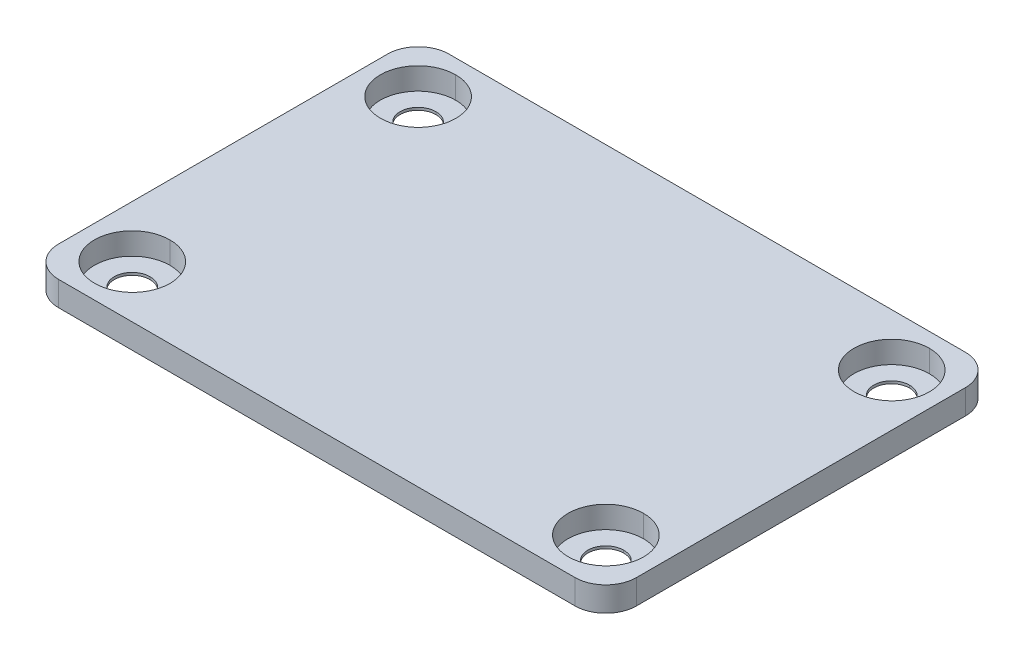
ISO-10303-21;
HEADER;
FILE_DESCRIPTION(('STEP AP214'),'2;1');
FILE_NAME('part.step','',(''),(''),'','','');
FILE_SCHEMA(('AUTOMOTIVE_DESIGN { 1 0 10303 214 1 1 1 1 }'));
ENDSEC;
DATA;
#1=APPLICATION_CONTEXT('core data for automotive mechanical design processes');
#2=APPLICATION_PROTOCOL_DEFINITION('international standard','automotive_design',2000,#1);
#3=PRODUCT_CONTEXT('',#1,'mechanical');
#4=PRODUCT('Part','Part','',(#3));
#5=PRODUCT_RELATED_PRODUCT_CATEGORY('part','',(#4));
#6=PRODUCT_DEFINITION_FORMATION('','',#4);
#7=PRODUCT_DEFINITION_CONTEXT('part definition',#1,'design');
#8=PRODUCT_DEFINITION('design','',#6,#7);
#9=PRODUCT_DEFINITION_SHAPE('','',#8);
#10=(LENGTH_UNIT() NAMED_UNIT(*) SI_UNIT(.MILLI.,.METRE.));
#11=(NAMED_UNIT(*) PLANE_ANGLE_UNIT() SI_UNIT($,.RADIAN.));
#12=(NAMED_UNIT(*) SI_UNIT($,.STERADIAN.) SOLID_ANGLE_UNIT());
#13=UNCERTAINTY_MEASURE_WITH_UNIT(LENGTH_MEASURE(1.E-05),#10,'distance_accuracy_value','');
#14=(GEOMETRIC_REPRESENTATION_CONTEXT(3) GLOBAL_UNCERTAINTY_ASSIGNED_CONTEXT((#13)) GLOBAL_UNIT_ASSIGNED_CONTEXT((#10,
#11,#12)) REPRESENTATION_CONTEXT('',''));
#15=CARTESIAN_POINT('',(0.,0.,0.));
#16=DIRECTION('',(0.,0.,1.));
#17=DIRECTION('',(1.,0.,0.));
#18=AXIS2_PLACEMENT_3D('',#15,#16,#17);
#19=CARTESIAN_POINT('',(-23.4468138885607,0.42,-47.7828830453356));
#20=DIRECTION('',(0.,-1.,0.));
#21=DIRECTION('',(0.,0.,-1.));
#22=AXIS2_PLACEMENT_3D('',#19,#20,#21);
#23=PLANE('',#22);
#24=CARTESIAN_POINT('',(-26.3468138885607,0.42,-47.7828830453356));
#25=DIRECTION('',(0.,1.,0.));
#26=DIRECTION('',(0.,0.,1.));
#27=AXIS2_PLACEMENT_3D('',#24,#25,#26);
#28=CIRCLE('',#27,6.12);
#29=CARTESIAN_POINT('',(-26.3218138885556,0.42,-53.902831983031));
#30=VERTEX_POINT('',#29);
#31=CARTESIAN_POINT('',(-26.3218138885658,0.42,-41.6629341076401));
#32=VERTEX_POINT('',#31);
#33=EDGE_CURVE('E226',#30,#32,#28,.T.);
#34=ORIENTED_EDGE('',*,*,#33,.T.);
#35=CARTESIAN_POINT('',(-26.2968138885607,0.42,-47.7828830453355));
#36=DIRECTION('',(0.,1.,0.));
#37=DIRECTION('',(0.,0.,1.));
#38=AXIS2_PLACEMENT_3D('',#35,#36,#37);
#39=CIRCLE('',#38,6.12);
#40=EDGE_CURVE('E686',#32,#30,#39,.T.);
#41=ORIENTED_EDGE('',*,*,#40,.T.);
#42=EDGE_LOOP('',(#34,#41));
#43=FACE_BOUND('',#42,.T.);
#44=CARTESIAN_POINT('',(-26.2968138885607,0.42,-47.7828830453355));
#45=DIRECTION('',(0.,1.,0.));
#46=DIRECTION('',(0.,0.,1.));
#47=AXIS2_PLACEMENT_3D('',#44,#45,#46);
#48=CIRCLE('',#47,2.9);
#49=CARTESIAN_POINT('',(-26.3218138885631,0.42,-44.8829908059584));
#50=VERTEX_POINT('',#49);
#51=CARTESIAN_POINT('',(-26.3218138885583,0.42,-50.6827752847127));
#52=VERTEX_POINT('',#51);
#53=EDGE_CURVE('E201',#50,#52,#48,.T.);
#54=ORIENTED_EDGE('',*,*,#53,.F.);
#55=CARTESIAN_POINT('',(-26.3468138885607,0.42,-47.7828830453356));
#56=DIRECTION('',(0.,1.,0.));
#57=DIRECTION('',(0.,0.,1.));
#58=AXIS2_PLACEMENT_3D('',#55,#56,#57);
#59=CIRCLE('',#58,2.9);
#60=EDGE_CURVE('E218',#52,#50,#59,.T.);
#61=ORIENTED_EDGE('',*,*,#60,.F.);
#62=EDGE_LOOP('',(#54,#61));
#63=FACE_BOUND('',#62,.T.);
#64=ADVANCED_FACE('F39',(#43,#63),#23,.F.);
#65=CARTESIAN_POINT('',(-23.4468138885607,0.42,-1.28288304533556));
#66=DIRECTION('',(0.,-1.,0.));
#67=DIRECTION('',(0.,0.,-1.));
#68=AXIS2_PLACEMENT_3D('',#65,#66,#67);
#69=PLANE('',#68);
#70=CARTESIAN_POINT('',(-26.3468138885607,0.42,-1.28288304533556));
#71=DIRECTION('',(0.,1.,0.));
#72=DIRECTION('',(0.,0.,1.));
#73=AXIS2_PLACEMENT_3D('',#70,#71,#72);
#74=CIRCLE('',#73,6.12);
#75=CARTESIAN_POINT('',(-26.3218138885596,0.42,-7.40283198303102));
#76=VERTEX_POINT('',#75);
#77=CARTESIAN_POINT('',(-26.3218138885619,0.42,4.83706589235992));
#78=VERTEX_POINT('',#77);
#79=EDGE_CURVE('E240',#76,#78,#74,.T.);
#80=ORIENTED_EDGE('',*,*,#79,.T.);
#81=CARTESIAN_POINT('',(-26.2968138885607,0.42,-1.28288304533555));
#82=DIRECTION('',(0.,1.,0.));
#83=DIRECTION('',(0.,0.,1.));
#84=AXIS2_PLACEMENT_3D('',#81,#82,#83);
#85=CIRCLE('',#84,6.12);
#86=EDGE_CURVE('E702',#78,#76,#85,.T.);
#87=ORIENTED_EDGE('',*,*,#86,.T.);
#88=EDGE_LOOP('',(#80,#87));
#89=FACE_BOUND('',#88,.T.);
#90=CARTESIAN_POINT('',(-26.2968138885607,0.42,-1.28288304533555));
#91=DIRECTION('',(0.,1.,0.));
#92=DIRECTION('',(0.,0.,1.));
#93=AXIS2_PLACEMENT_3D('',#90,#91,#92);
#94=CIRCLE('',#93,2.9);
#95=CARTESIAN_POINT('',(-26.3218138885613,0.42,1.61700919404163));
#96=VERTEX_POINT('',#95);
#97=CARTESIAN_POINT('',(-26.3218138885602,0.42,-4.18277528471273));
#98=VERTEX_POINT('',#97);
#99=EDGE_CURVE('E213',#96,#98,#94,.T.);
#100=ORIENTED_EDGE('',*,*,#99,.F.);
#101=CARTESIAN_POINT('',(-26.3468138885607,0.42,-1.28288304533556));
#102=DIRECTION('',(0.,1.,0.));
#103=DIRECTION('',(0.,0.,1.));
#104=AXIS2_PLACEMENT_3D('',#101,#102,#103);
#105=CIRCLE('',#104,2.9);
#106=EDGE_CURVE('E244',#98,#96,#105,.T.);
#107=ORIENTED_EDGE('',*,*,#106,.F.);
#108=EDGE_LOOP('',(#100,#107));
#109=FACE_BOUND('',#108,.T.);
#110=ADVANCED_FACE('F396',(#89,#109),#69,.F.);
#111=CARTESIAN_POINT('',(53.6031861114393,0.42,-47.7828830453356));
#112=DIRECTION('',(0.,-1.,0.));
#113=DIRECTION('',(0.,0.,-1.));
#114=AXIS2_PLACEMENT_3D('',#111,#112,#113);
#115=PLANE('',#114);
#116=CARTESIAN_POINT('',(50.7031861114393,0.42,-47.7828830453356));
#117=DIRECTION('',(0.,1.,0.));
#118=DIRECTION('',(0.,0.,1.));
#119=AXIS2_PLACEMENT_3D('',#116,#117,#118);
#120=CIRCLE('',#119,6.12);
#121=CARTESIAN_POINT('',(50.7281861114427,0.42,-53.902831983031));
#122=VERTEX_POINT('',#121);
#123=CARTESIAN_POINT('',(50.7281861114359,0.42,-41.6629341076401));
#124=VERTEX_POINT('',#123);
#125=EDGE_CURVE('E266',#122,#124,#120,.T.);
#126=ORIENTED_EDGE('',*,*,#125,.T.);
#127=CARTESIAN_POINT('',(50.7531861114393,0.42,-47.7828830453355));
#128=DIRECTION('',(0.,1.,0.));
#129=DIRECTION('',(0.,0.,1.));
#130=AXIS2_PLACEMENT_3D('',#127,#128,#129);
#131=CIRCLE('',#130,6.12);
#132=EDGE_CURVE('E731',#124,#122,#131,.T.);
#133=ORIENTED_EDGE('',*,*,#132,.T.);
#134=EDGE_LOOP('',(#126,#133));
#135=FACE_BOUND('',#134,.T.);
#136=CARTESIAN_POINT('',(50.7531861114393,0.42,-47.7828830453355));
#137=DIRECTION('',(0.,1.,0.));
#138=DIRECTION('',(0.,0.,1.));
#139=AXIS2_PLACEMENT_3D('',#136,#137,#138);
#140=CIRCLE('',#139,2.9);
#141=CARTESIAN_POINT('',(50.7281861114377,0.42,-44.8829908059584));
#142=VERTEX_POINT('',#141);
#143=CARTESIAN_POINT('',(50.7281861114409,0.42,-50.6827752847127));
#144=VERTEX_POINT('',#143);
#145=EDGE_CURVE('E708',#142,#144,#140,.T.);
#146=ORIENTED_EDGE('',*,*,#145,.F.);
#147=CARTESIAN_POINT('',(50.7031861114393,0.42,-47.7828830453356));
#148=DIRECTION('',(0.,1.,0.));
#149=DIRECTION('',(0.,0.,1.));
#150=AXIS2_PLACEMENT_3D('',#147,#148,#149);
#151=CIRCLE('',#150,2.9);
#152=EDGE_CURVE('E270',#144,#142,#151,.T.);
#153=ORIENTED_EDGE('',*,*,#152,.F.);
#154=EDGE_LOOP('',(#146,#153));
#155=FACE_BOUND('',#154,.T.);
#156=ADVANCED_FACE('F402',(#135,#155),#115,.F.);
#157=CARTESIAN_POINT('',(53.6031861114393,0.42,-1.28288304533555));
#158=DIRECTION('',(0.,-1.,0.));
#159=DIRECTION('',(0.,0.,-1.));
#160=AXIS2_PLACEMENT_3D('',#157,#158,#159);
#161=PLANE('',#160);
#162=CARTESIAN_POINT('',(50.7031861114393,0.42,-1.28288304533555));
#163=DIRECTION('',(0.,1.,0.));
#164=DIRECTION('',(0.,0.,1.));
#165=AXIS2_PLACEMENT_3D('',#162,#163,#164);
#166=CIRCLE('',#165,6.12);
#167=CARTESIAN_POINT('',(50.7281861114401,0.42,-7.40283198303103));
#168=VERTEX_POINT('',#167);
#169=CARTESIAN_POINT('',(50.7281861114384,0.42,4.83706589235993));
#170=VERTEX_POINT('',#169);
#171=EDGE_CURVE('E253',#168,#170,#166,.T.);
#172=ORIENTED_EDGE('',*,*,#171,.T.);
#173=CARTESIAN_POINT('',(50.7531861114393,0.42,-1.28288304533555));
#174=DIRECTION('',(0.,1.,0.));
#175=DIRECTION('',(0.,0.,1.));
#176=AXIS2_PLACEMENT_3D('',#173,#174,#175);
#177=CIRCLE('',#176,6.12);
#178=EDGE_CURVE('E759',#170,#168,#177,.T.);
#179=ORIENTED_EDGE('',*,*,#178,.T.);
#180=EDGE_LOOP('',(#172,#179));
#181=FACE_BOUND('',#180,.T.);
#182=CARTESIAN_POINT('',(50.7531861114393,0.42,-1.28288304533555));
#183=DIRECTION('',(0.,1.,0.));
#184=DIRECTION('',(0.,0.,1.));
#185=AXIS2_PLACEMENT_3D('',#182,#183,#184);
#186=CIRCLE('',#185,2.9);
#187=CARTESIAN_POINT('',(50.7281861114389,0.42,1.61700919404163));
#188=VERTEX_POINT('',#187);
#189=CARTESIAN_POINT('',(50.7281861114397,0.42,-4.18277528471273));
#190=VERTEX_POINT('',#189);
#191=EDGE_CURVE('E290',#188,#190,#186,.T.);
#192=ORIENTED_EDGE('',*,*,#191,.F.);
#193=CARTESIAN_POINT('',(50.7031861114393,0.42,-1.28288304533555));
#194=DIRECTION('',(0.,1.,0.));
#195=DIRECTION('',(0.,0.,1.));
#196=AXIS2_PLACEMENT_3D('',#193,#194,#195);
#197=CIRCLE('',#196,2.9);
#198=EDGE_CURVE('E257',#190,#188,#197,.T.);
#199=ORIENTED_EDGE('',*,*,#198,.F.);
#200=EDGE_LOOP('',(#192,#199));
#201=FACE_BOUND('',#200,.T.);
#202=ADVANCED_FACE('F424',(#181,#201),#161,.F.);
#203=CARTESIAN_POINT('',(-34.7968138885607,4.,-56.2828830453355));
#204=DIRECTION('',(1.,0.,0.));
#205=DIRECTION('',(0.,0.,-1.));
#206=AXIS2_PLACEMENT_3D('',#203,#204,#205);
#207=PLANE('',#206);
#208=DIRECTION('',(0.,0.,1.));
#209=VECTOR('',#208,1.);
#210=CARTESIAN_POINT('',(-34.7968138885607,0.,-56.2828830453355));
#211=LINE('',#210,#209);
#212=CARTESIAN_POINT('',(-34.7968138885607,0.,-51.2828830453356));
#213=VERTEX_POINT('',#212);
#214=CARTESIAN_POINT('',(-34.7968138885607,0.,2.21711695466446));
#215=VERTEX_POINT('',#214);
#216=EDGE_CURVE('E291',#213,#215,#211,.T.);
#217=ORIENTED_EDGE('',*,*,#216,.T.);
#218=DIRECTION('',(0.,-1.,0.));
#219=VECTOR('',#218,1.);
#220=CARTESIAN_POINT('',(-34.7968138885607,4.,2.21711695466446));
#221=LINE('',#220,#219);
#222=CARTESIAN_POINT('',(-34.7968138885607,4.,2.21711695466446));
#223=VERTEX_POINT('',#222);
#224=EDGE_CURVE('E11',#215,#223,#221,.F.);
#225=ORIENTED_EDGE('',*,*,#224,.T.);
#226=DIRECTION('',(0.,0.,1.));
#227=VECTOR('',#226,1.);
#228=CARTESIAN_POINT('',(-34.7968138885607,4.,-56.2828830453355));
#229=LINE('',#228,#227);
#230=CARTESIAN_POINT('',(-34.7968138885607,4.,-51.2828830453356));
#231=VERTEX_POINT('',#230);
#232=EDGE_CURVE('E275',#231,#223,#229,.T.);
#233=ORIENTED_EDGE('',*,*,#232,.F.);
#234=DIRECTION('',(0.,-1.,0.));
#235=VECTOR('',#234,1.);
#236=CARTESIAN_POINT('',(-34.7968138885607,4.,-51.2828830453356));
#237=LINE('',#236,#235);
#238=EDGE_CURVE('E48',#231,#213,#237,.T.);
#239=ORIENTED_EDGE('',*,*,#238,.T.);
#240=EDGE_LOOP('',(#217,#225,#233,#239));
#241=FACE_BOUND('',#240,.T.);
#242=ADVANCED_FACE('F361',(#241),#207,.F.);
#243=CARTESIAN_POINT('',(-34.7968138885607,4.,7.21711695466445));
#244=DIRECTION('',(0.,0.,-1.));
#245=DIRECTION('',(-1.,0.,0.));
#246=AXIS2_PLACEMENT_3D('',#243,#244,#245);
#247=PLANE('',#246);
#248=DIRECTION('',(1.,0.,0.));
#249=VECTOR('',#248,1.);
#250=CARTESIAN_POINT('',(-34.7968138885607,0.,7.21711695466445));
#251=LINE('',#250,#249);
#252=CARTESIAN_POINT('',(-29.7968138885607,0.,7.21711695466445));
#253=VERTEX_POINT('',#252);
#254=CARTESIAN_POINT('',(54.2031861114393,0.,7.21711695466445));
#255=VERTEX_POINT('',#254);
#256=EDGE_CURVE('E295',#253,#255,#251,.T.);
#257=ORIENTED_EDGE('',*,*,#256,.T.);
#258=DIRECTION('',(0.,-1.,0.));
#259=VECTOR('',#258,1.);
#260=CARTESIAN_POINT('',(54.2031861114393,4.,7.21711695466445));
#261=LINE('',#260,#259);
#262=CARTESIAN_POINT('',(54.2031861114393,4.,7.21711695466445));
#263=VERTEX_POINT('',#262);
#264=EDGE_CURVE('E336',#255,#263,#261,.F.);
#265=ORIENTED_EDGE('',*,*,#264,.T.);
#266=DIRECTION('',(1.,0.,0.));
#267=VECTOR('',#266,1.);
#268=CARTESIAN_POINT('',(-34.7968138885607,4.,7.21711695466445));
#269=LINE('',#268,#267);
#270=CARTESIAN_POINT('',(-29.7968138885607,4.,7.21711695466445));
#271=VERTEX_POINT('',#270);
#272=EDGE_CURVE('E279',#271,#263,#269,.T.);
#273=ORIENTED_EDGE('',*,*,#272,.F.);
#274=DIRECTION('',(0.,-1.,0.));
#275=VECTOR('',#274,1.);
#276=CARTESIAN_POINT('',(-29.7968138885607,4.,7.21711695466445));
#277=LINE('',#276,#275);
#278=EDGE_CURVE('E332',#271,#253,#277,.T.);
#279=ORIENTED_EDGE('',*,*,#278,.T.);
#280=EDGE_LOOP('',(#257,#265,#273,#279));
#281=FACE_BOUND('',#280,.T.);
#282=ADVANCED_FACE('F376',(#281),#247,.F.);
#283=CARTESIAN_POINT('',(59.2031861114393,4.,-56.2828830453355));
#284=DIRECTION('',(-1.,0.,0.));
#285=DIRECTION('',(0.,0.,1.));
#286=AXIS2_PLACEMENT_3D('',#283,#284,#285);
#287=PLANE('',#286);
#288=DIRECTION('',(0.,0.,-1.));
#289=VECTOR('',#288,1.);
#290=CARTESIAN_POINT('',(59.2031861114393,4.,-56.2828830453355));
#291=LINE('',#290,#289);
#292=CARTESIAN_POINT('',(59.2031861114393,4.,2.21711695466446));
#293=VERTEX_POINT('',#292);
#294=CARTESIAN_POINT('',(59.2031861114393,4.,-51.2828830453356));
#295=VERTEX_POINT('',#294);
#296=EDGE_CURVE('E284',#293,#295,#291,.T.);
#297=ORIENTED_EDGE('',*,*,#296,.F.);
#298=DIRECTION('',(0.,-1.,0.));
#299=VECTOR('',#298,1.);
#300=CARTESIAN_POINT('',(59.2031861114393,4.,2.21711695466446));
#301=LINE('',#300,#299);
#302=CARTESIAN_POINT('',(59.2031861114393,0.,2.21711695466446));
#303=VERTEX_POINT('',#302);
#304=EDGE_CURVE('E316',#293,#303,#301,.T.);
#305=ORIENTED_EDGE('',*,*,#304,.T.);
#306=DIRECTION('',(0.,0.,-1.));
#307=VECTOR('',#306,1.);
#308=CARTESIAN_POINT('',(59.2031861114393,0.,-56.2828830453355));
#309=LINE('',#308,#307);
#310=CARTESIAN_POINT('',(59.2031861114393,0.,-51.2828830453356));
#311=VERTEX_POINT('',#310);
#312=EDGE_CURVE('E299',#303,#311,#309,.T.);
#313=ORIENTED_EDGE('',*,*,#312,.T.);
#314=DIRECTION('',(0.,-1.,0.));
#315=VECTOR('',#314,1.);
#316=CARTESIAN_POINT('',(59.2031861114393,4.,-51.2828830453356));
#317=LINE('',#316,#315);
#318=EDGE_CURVE('E212',#311,#295,#317,.F.);
#319=ORIENTED_EDGE('',*,*,#318,.T.);
#320=EDGE_LOOP('',(#297,#305,#313,#319));
#321=FACE_BOUND('',#320,.T.);
#322=ADVANCED_FACE('F385',(#321),#287,.F.);
#323=CARTESIAN_POINT('',(-34.7968138885607,4.,-56.2828830453355));
#324=DIRECTION('',(0.,0.,1.));
#325=DIRECTION('',(1.,0.,0.));
#326=AXIS2_PLACEMENT_3D('',#323,#324,#325);
#327=PLANE('',#326);
#328=DIRECTION('',(-1.,0.,0.));
#329=VECTOR('',#328,1.);
#330=CARTESIAN_POINT('',(-34.7968138885607,4.,-56.2828830453355));
#331=LINE('',#330,#329);
#332=CARTESIAN_POINT('',(54.2031861114393,4.,-56.2828830453355));
#333=VERTEX_POINT('',#332);
#334=CARTESIAN_POINT('',(-29.7968138885607,4.,-56.2828830453355));
#335=VERTEX_POINT('',#334);
#336=EDGE_CURVE('E287',#333,#335,#331,.T.);
#337=ORIENTED_EDGE('',*,*,#336,.F.);
#338=DIRECTION('',(0.,-1.,0.));
#339=VECTOR('',#338,1.);
#340=CARTESIAN_POINT('',(54.2031861114393,4.,-56.2828830453355));
#341=LINE('',#340,#339);
#342=CARTESIAN_POINT('',(54.2031861114393,0.,-56.2828830453355));
#343=VERTEX_POINT('',#342);
#344=EDGE_CURVE('E352',#333,#343,#341,.T.);
#345=ORIENTED_EDGE('',*,*,#344,.T.);
#346=DIRECTION('',(-1.,0.,0.));
#347=VECTOR('',#346,1.);
#348=CARTESIAN_POINT('',(-34.7968138885607,0.,-56.2828830453355));
#349=LINE('',#348,#347);
#350=CARTESIAN_POINT('',(-29.7968138885607,0.,-56.2828830453355));
#351=VERTEX_POINT('',#350);
#352=EDGE_CURVE('E280',#343,#351,#349,.T.);
#353=ORIENTED_EDGE('',*,*,#352,.T.);
#354=DIRECTION('',(0.,-1.,0.));
#355=VECTOR('',#354,1.);
#356=CARTESIAN_POINT('',(-29.7968138885607,4.,-56.2828830453355));
#357=LINE('',#356,#355);
#358=EDGE_CURVE('E55',#351,#335,#357,.F.);
#359=ORIENTED_EDGE('',*,*,#358,.T.);
#360=EDGE_LOOP('',(#337,#345,#353,#359));
#361=FACE_BOUND('',#360,.T.);
#362=ADVANCED_FACE('F390',(#361),#327,.F.);
#363=CARTESIAN_POINT('',(0.,4.,0.));
#364=DIRECTION('',(0.,1.,0.));
#365=DIRECTION('',(0.,0.,1.));
#366=AXIS2_PLACEMENT_3D('',#363,#364,#365);
#367=PLANE('',#366);
#368=CARTESIAN_POINT('',(-26.2968138885607,4.,-47.7828830453355));
#369=DIRECTION('',(0.,1.,0.));
#370=DIRECTION('',(0.,0.,1.));
#371=AXIS2_PLACEMENT_3D('',#368,#369,#370);
#372=CIRCLE('',#371,6.12);
#373=CARTESIAN_POINT('',(-26.3218138885658,4.,-41.6629341076401));
#374=VERTEX_POINT('',#373);
#375=CARTESIAN_POINT('',(-26.3218138885556,4.,-53.902831983031));
#376=VERTEX_POINT('',#375);
#377=EDGE_CURVE('E688',#374,#376,#372,.T.);
#378=ORIENTED_EDGE('',*,*,#377,.F.);
#379=CARTESIAN_POINT('',(-26.3468138885607,4.,-47.7828830453356));
#380=DIRECTION('',(0.,1.,0.));
#381=DIRECTION('',(0.,0.,1.));
#382=AXIS2_PLACEMENT_3D('',#379,#380,#381);
#383=CIRCLE('',#382,6.12);
#384=EDGE_CURVE('E233',#376,#374,#383,.T.);
#385=ORIENTED_EDGE('',*,*,#384,.F.);
#386=EDGE_LOOP('',(#378,#385));
#387=FACE_BOUND('',#386,.T.);
#388=CARTESIAN_POINT('',(-26.2968138885607,4.,-1.28288304533555));
#389=DIRECTION('',(0.,1.,0.));
#390=DIRECTION('',(0.,0.,1.));
#391=AXIS2_PLACEMENT_3D('',#388,#389,#390);
#392=CIRCLE('',#391,6.12);
#393=CARTESIAN_POINT('',(-26.3218138885619,4.,4.83706589235992));
#394=VERTEX_POINT('',#393);
#395=CARTESIAN_POINT('',(-26.3218138885596,4.,-7.40283198303103));
#396=VERTEX_POINT('',#395);
#397=EDGE_CURVE('E222',#394,#396,#392,.T.);
#398=ORIENTED_EDGE('',*,*,#397,.F.);
#399=CARTESIAN_POINT('',(-26.3468138885607,4.,-1.28288304533556));
#400=DIRECTION('',(0.,1.,0.));
#401=DIRECTION('',(0.,0.,1.));
#402=AXIS2_PLACEMENT_3D('',#399,#400,#401);
#403=CIRCLE('',#402,6.12);
#404=EDGE_CURVE('E230',#396,#394,#403,.T.);
#405=ORIENTED_EDGE('',*,*,#404,.F.);
#406=EDGE_LOOP('',(#398,#405));
#407=FACE_BOUND('',#406,.T.);
#408=CARTESIAN_POINT('',(50.7531861114393,4.,-47.7828830453355));
#409=DIRECTION('',(0.,1.,0.));
#410=DIRECTION('',(0.,0.,1.));
#411=AXIS2_PLACEMENT_3D('',#408,#409,#410);
#412=CIRCLE('',#411,6.12);
#413=CARTESIAN_POINT('',(50.7281861114359,4.,-41.6629341076401));
#414=VERTEX_POINT('',#413);
#415=CARTESIAN_POINT('',(50.7281861114427,4.,-53.902831983031));
#416=VERTEX_POINT('',#415);
#417=EDGE_CURVE('E728',#414,#416,#412,.T.);
#418=ORIENTED_EDGE('',*,*,#417,.F.);
#419=CARTESIAN_POINT('',(50.7031861114393,4.,-47.7828830453356));
#420=DIRECTION('',(0.,1.,0.));
#421=DIRECTION('',(0.,0.,1.));
#422=AXIS2_PLACEMENT_3D('',#419,#420,#421);
#423=CIRCLE('',#422,6.12);
#424=EDGE_CURVE('E262',#416,#414,#423,.T.);
#425=ORIENTED_EDGE('',*,*,#424,.F.);
#426=EDGE_LOOP('',(#418,#425));
#427=FACE_BOUND('',#426,.T.);
#428=CARTESIAN_POINT('',(50.7531861114393,4.,-1.28288304533555));
#429=DIRECTION('',(0.,1.,0.));
#430=DIRECTION('',(0.,0.,1.));
#431=AXIS2_PLACEMENT_3D('',#428,#429,#430);
#432=CIRCLE('',#431,6.12);
#433=CARTESIAN_POINT('',(50.7281861114384,4.,4.83706589235993));
#434=VERTEX_POINT('',#433);
#435=CARTESIAN_POINT('',(50.7281861114401,4.,-7.40283198303103));
#436=VERTEX_POINT('',#435);
#437=EDGE_CURVE('E756',#434,#436,#432,.T.);
#438=ORIENTED_EDGE('',*,*,#437,.F.);
#439=CARTESIAN_POINT('',(50.7031861114393,4.,-1.28288304533555));
#440=DIRECTION('',(0.,1.,0.));
#441=DIRECTION('',(0.,0.,1.));
#442=AXIS2_PLACEMENT_3D('',#439,#440,#441);
#443=CIRCLE('',#442,6.12);
#444=EDGE_CURVE('E249',#436,#434,#443,.T.);
#445=ORIENTED_EDGE('',*,*,#444,.F.);
#446=EDGE_LOOP('',(#438,#445));
#447=FACE_BOUND('',#446,.T.);
#448=ORIENTED_EDGE('',*,*,#272,.T.);
#449=CARTESIAN_POINT('',(54.2031861114393,4.,2.21711695466446));
#450=DIRECTION('',(0.,1.,0.));
#451=DIRECTION('',(0.,0.,1.));
#452=AXIS2_PLACEMENT_3D('',#449,#450,#451);
#453=CIRCLE('',#452,5.);
#454=EDGE_CURVE('E347',#263,#293,#453,.T.);
#455=ORIENTED_EDGE('',*,*,#454,.T.);
#456=ORIENTED_EDGE('',*,*,#296,.T.);
#457=CARTESIAN_POINT('',(54.2031861114393,4.,-51.2828830453356));
#458=DIRECTION('',(0.,1.,0.));
#459=DIRECTION('',(0.,0.,1.));
#460=AXIS2_PLACEMENT_3D('',#457,#458,#459);
#461=CIRCLE('',#460,5.);
#462=EDGE_CURVE('E62',#295,#333,#461,.T.);
#463=ORIENTED_EDGE('',*,*,#462,.T.);
#464=ORIENTED_EDGE('',*,*,#336,.T.);
#465=CARTESIAN_POINT('',(-29.7968138885607,4.,-51.2828830453356));
#466=DIRECTION('',(0.,1.,0.));
#467=DIRECTION('',(0.,0.,1.));
#468=AXIS2_PLACEMENT_3D('',#465,#466,#467);
#469=CIRCLE('',#468,5.);
#470=EDGE_CURVE('E339',#335,#231,#469,.T.);
#471=ORIENTED_EDGE('',*,*,#470,.T.);
#472=ORIENTED_EDGE('',*,*,#232,.T.);
#473=CARTESIAN_POINT('',(-29.7968138885607,4.,2.21711695466445));
#474=DIRECTION('',(0.,1.,0.));
#475=DIRECTION('',(0.,0.,1.));
#476=AXIS2_PLACEMENT_3D('',#473,#474,#475);
#477=CIRCLE('',#476,5.);
#478=EDGE_CURVE('E342',#223,#271,#477,.T.);
#479=ORIENTED_EDGE('',*,*,#478,.T.);
#480=EDGE_LOOP('',(#448,#455,#456,#463,#464,#471,#472,#479));
#481=FACE_BOUND('',#480,.T.);
#482=ADVANCED_FACE('F379',(#387,#407,#427,#447,#481),#367,.T.);
#483=CARTESIAN_POINT('',(0.,0.,0.));
#484=DIRECTION('',(0.,1.,0.));
#485=DIRECTION('',(0.,0.,1.));
#486=AXIS2_PLACEMENT_3D('',#483,#484,#485);
#487=PLANE('',#486);
#488=CARTESIAN_POINT('',(-26.3468138885607,0.,-47.7828830453356));
#489=DIRECTION('',(0.,1.,0.));
#490=DIRECTION('',(0.,0.,1.));
#491=AXIS2_PLACEMENT_3D('',#488,#489,#490);
#492=CIRCLE('',#491,2.9);
#493=CARTESIAN_POINT('',(-26.3218138885583,0.,-50.6827752847127));
#494=VERTEX_POINT('',#493);
#495=CARTESIAN_POINT('',(-26.3218138885631,0.,-44.8829908059584));
#496=VERTEX_POINT('',#495);
#497=EDGE_CURVE('E220',#494,#496,#492,.T.);
#498=ORIENTED_EDGE('',*,*,#497,.T.);
#499=CARTESIAN_POINT('',(-26.2968138885607,0.,-47.7828830453355));
#500=DIRECTION('',(0.,1.,0.));
#501=DIRECTION('',(0.,0.,1.));
#502=AXIS2_PLACEMENT_3D('',#499,#500,#501);
#503=CIRCLE('',#502,2.9);
#504=EDGE_CURVE('E223',#496,#494,#503,.T.);
#505=ORIENTED_EDGE('',*,*,#504,.T.);
#506=EDGE_LOOP('',(#498,#505));
#507=FACE_BOUND('',#506,.T.);
#508=CARTESIAN_POINT('',(-26.3468138885607,0.,-1.28288304533556));
#509=DIRECTION('',(0.,1.,0.));
#510=DIRECTION('',(0.,0.,1.));
#511=AXIS2_PLACEMENT_3D('',#508,#509,#510);
#512=CIRCLE('',#511,2.9);
#513=CARTESIAN_POINT('',(-26.3218138885602,0.,-4.18277528471273));
#514=VERTEX_POINT('',#513);
#515=CARTESIAN_POINT('',(-26.3218138885613,0.,1.61700919404163));
#516=VERTEX_POINT('',#515);
#517=EDGE_CURVE('E248',#514,#516,#512,.T.);
#518=ORIENTED_EDGE('',*,*,#517,.T.);
#519=CARTESIAN_POINT('',(-26.2968138885607,0.,-1.28288304533555));
#520=DIRECTION('',(0.,1.,0.));
#521=DIRECTION('',(0.,0.,1.));
#522=AXIS2_PLACEMENT_3D('',#519,#520,#521);
#523=CIRCLE('',#522,2.9);
#524=EDGE_CURVE('E720',#516,#514,#523,.T.);
#525=ORIENTED_EDGE('',*,*,#524,.T.);
#526=EDGE_LOOP('',(#518,#525));
#527=FACE_BOUND('',#526,.T.);
#528=CARTESIAN_POINT('',(50.7031861114393,0.,-1.28288304533555));
#529=DIRECTION('',(0.,1.,0.));
#530=DIRECTION('',(0.,0.,1.));
#531=AXIS2_PLACEMENT_3D('',#528,#529,#530);
#532=CIRCLE('',#531,2.9);
#533=CARTESIAN_POINT('',(50.7281861114397,0.,-4.18277528471273));
#534=VERTEX_POINT('',#533);
#535=CARTESIAN_POINT('',(50.7281861114389,0.,1.61700919404163));
#536=VERTEX_POINT('',#535);
#537=EDGE_CURVE('E261',#534,#536,#532,.T.);
#538=ORIENTED_EDGE('',*,*,#537,.T.);
#539=CARTESIAN_POINT('',(50.7531861114393,0.,-1.28288304533555));
#540=DIRECTION('',(0.,1.,0.));
#541=DIRECTION('',(0.,0.,1.));
#542=AXIS2_PLACEMENT_3D('',#539,#540,#541);
#543=CIRCLE('',#542,2.9);
#544=EDGE_CURVE('E776',#536,#534,#543,.T.);
#545=ORIENTED_EDGE('',*,*,#544,.T.);
#546=EDGE_LOOP('',(#538,#545));
#547=FACE_BOUND('',#546,.T.);
#548=CARTESIAN_POINT('',(50.7031861114393,0.,-47.7828830453356));
#549=DIRECTION('',(0.,1.,0.));
#550=DIRECTION('',(0.,0.,1.));
#551=AXIS2_PLACEMENT_3D('',#548,#549,#550);
#552=CIRCLE('',#551,2.9);
#553=CARTESIAN_POINT('',(50.7281861114409,0.,-50.6827752847127));
#554=VERTEX_POINT('',#553);
#555=CARTESIAN_POINT('',(50.7281861114377,0.,-44.8829908059584));
#556=VERTEX_POINT('',#555);
#557=EDGE_CURVE('E274',#554,#556,#552,.T.);
#558=ORIENTED_EDGE('',*,*,#557,.T.);
#559=CARTESIAN_POINT('',(50.7531861114393,0.,-47.7828830453355));
#560=DIRECTION('',(0.,1.,0.));
#561=DIRECTION('',(0.,0.,1.));
#562=AXIS2_PLACEMENT_3D('',#559,#560,#561);
#563=CIRCLE('',#562,2.9);
#564=EDGE_CURVE('E748',#556,#554,#563,.T.);
#565=ORIENTED_EDGE('',*,*,#564,.T.);
#566=EDGE_LOOP('',(#558,#565));
#567=FACE_BOUND('',#566,.T.);
#568=ORIENTED_EDGE('',*,*,#312,.F.);
#569=CARTESIAN_POINT('',(54.2031861114393,0.,2.21711695466446));
#570=DIRECTION('',(0.,1.,0.));
#571=DIRECTION('',(0.,0.,1.));
#572=AXIS2_PLACEMENT_3D('',#569,#570,#571);
#573=CIRCLE('',#572,5.);
#574=EDGE_CURVE('E329',#303,#255,#573,.F.);
#575=ORIENTED_EDGE('',*,*,#574,.T.);
#576=ORIENTED_EDGE('',*,*,#256,.F.);
#577=CARTESIAN_POINT('',(-29.7968138885607,0.,2.21711695466445));
#578=DIRECTION('',(0.,1.,0.));
#579=DIRECTION('',(0.,0.,1.));
#580=AXIS2_PLACEMENT_3D('',#577,#578,#579);
#581=CIRCLE('',#580,5.);
#582=EDGE_CURVE('E323',#253,#215,#581,.F.);
#583=ORIENTED_EDGE('',*,*,#582,.T.);
#584=ORIENTED_EDGE('',*,*,#216,.F.);
#585=CARTESIAN_POINT('',(-29.7968138885607,0.,-51.2828830453356));
#586=DIRECTION('',(0.,1.,0.));
#587=DIRECTION('',(0.,0.,1.));
#588=AXIS2_PLACEMENT_3D('',#585,#586,#587);
#589=CIRCLE('',#588,5.);
#590=EDGE_CURVE('E320',#213,#351,#589,.F.);
#591=ORIENTED_EDGE('',*,*,#590,.T.);
#592=ORIENTED_EDGE('',*,*,#352,.F.);
#593=CARTESIAN_POINT('',(54.2031861114393,0.,-51.2828830453356));
#594=DIRECTION('',(0.,1.,0.));
#595=DIRECTION('',(0.,0.,1.));
#596=AXIS2_PLACEMENT_3D('',#593,#594,#595);
#597=CIRCLE('',#596,5.);
#598=EDGE_CURVE('E326',#343,#311,#597,.F.);
#599=ORIENTED_EDGE('',*,*,#598,.T.);
#600=EDGE_LOOP('',(#568,#575,#576,#583,#584,#591,#592,#599));
#601=FACE_BOUND('',#600,.T.);
#602=ADVANCED_FACE('F367',(#507,#527,#547,#567,#601),#487,.F.);
#603=CARTESIAN_POINT('',(50.7031861114393,4.,-47.7828830453356));
#604=DIRECTION('',(0.,1.,0.));
#605=DIRECTION('',(0.,0.,1.));
#606=AXIS2_PLACEMENT_3D('',#603,#604,#605);
#607=CYLINDRICAL_SURFACE('',#606,2.9);
#608=ORIENTED_EDGE('',*,*,#557,.F.);
#609=DIRECTION('',(0.,1.,0.));
#610=VECTOR('',#609,1.);
#611=CARTESIAN_POINT('',(50.7281861114409,-6.79,-50.6827752847127));
#612=LINE('',#611,#610);
#613=EDGE_CURVE('E752',#554,#144,#612,.T.);
#614=ORIENTED_EDGE('',*,*,#613,.T.);
#615=ORIENTED_EDGE('',*,*,#152,.T.);
#616=DIRECTION('',(0.,1.,0.));
#617=VECTOR('',#616,1.);
#618=CARTESIAN_POINT('',(50.7281861114377,-6.79,-44.8829908059584));
#619=LINE('',#618,#617);
#620=EDGE_CURVE('E744',#142,#556,#619,.F.);
#621=ORIENTED_EDGE('',*,*,#620,.T.);
#622=EDGE_LOOP('',(#608,#614,#615,#621));
#623=FACE_BOUND('',#622,.T.);
#624=ADVANCED_FACE('F434',(#623),#607,.F.);
#625=CARTESIAN_POINT('',(50.7031861114393,4.,-47.7828830453356));
#626=DIRECTION('',(0.,1.,0.));
#627=DIRECTION('',(0.,0.,1.));
#628=AXIS2_PLACEMENT_3D('',#625,#626,#627);
#629=CYLINDRICAL_SURFACE('',#628,6.12);
#630=ORIENTED_EDGE('',*,*,#125,.F.);
#631=DIRECTION('',(0.,1.,0.));
#632=VECTOR('',#631,1.);
#633=CARTESIAN_POINT('',(50.7281861114427,2.21,-53.902831983031));
#634=LINE('',#633,#632);
#635=EDGE_CURVE('E740',#122,#416,#634,.T.);
#636=ORIENTED_EDGE('',*,*,#635,.T.);
#637=ORIENTED_EDGE('',*,*,#424,.T.);
#638=DIRECTION('',(0.,1.,0.));
#639=VECTOR('',#638,1.);
#640=CARTESIAN_POINT('',(50.7281861114359,2.21,-41.6629341076401));
#641=LINE('',#640,#639);
#642=EDGE_CURVE('E734',#414,#124,#641,.F.);
#643=ORIENTED_EDGE('',*,*,#642,.T.);
#644=EDGE_LOOP('',(#630,#636,#637,#643));
#645=FACE_BOUND('',#644,.T.);
#646=ADVANCED_FACE('F430',(#645),#629,.F.);
#647=CARTESIAN_POINT('',(50.7031861114393,4.,-1.28288304533555));
#648=DIRECTION('',(0.,1.,0.));
#649=DIRECTION('',(0.,0.,1.));
#650=AXIS2_PLACEMENT_3D('',#647,#648,#649);
#651=CYLINDRICAL_SURFACE('',#650,2.9);
#652=ORIENTED_EDGE('',*,*,#537,.F.);
#653=DIRECTION('',(0.,1.,0.));
#654=VECTOR('',#653,1.);
#655=CARTESIAN_POINT('',(50.7281861114397,-6.79,-4.18277528471273));
#656=LINE('',#655,#654);
#657=EDGE_CURVE('E780',#534,#190,#656,.T.);
#658=ORIENTED_EDGE('',*,*,#657,.T.);
#659=ORIENTED_EDGE('',*,*,#198,.T.);
#660=DIRECTION('',(0.,1.,0.));
#661=VECTOR('',#660,1.);
#662=CARTESIAN_POINT('',(50.7281861114389,-6.79,1.61700919404163));
#663=LINE('',#662,#661);
#664=EDGE_CURVE('E772',#188,#536,#663,.F.);
#665=ORIENTED_EDGE('',*,*,#664,.T.);
#666=EDGE_LOOP('',(#652,#658,#659,#665));
#667=FACE_BOUND('',#666,.T.);
#668=ADVANCED_FACE('F422',(#667),#651,.F.);
#669=CARTESIAN_POINT('',(50.7031861114393,4.,-1.28288304533555));
#670=DIRECTION('',(0.,1.,0.));
#671=DIRECTION('',(0.,0.,1.));
#672=AXIS2_PLACEMENT_3D('',#669,#670,#671);
#673=CYLINDRICAL_SURFACE('',#672,6.12);
#674=ORIENTED_EDGE('',*,*,#171,.F.);
#675=DIRECTION('',(0.,1.,0.));
#676=VECTOR('',#675,1.);
#677=CARTESIAN_POINT('',(50.7281861114401,2.21,-7.40283198303103));
#678=LINE('',#677,#676);
#679=EDGE_CURVE('E768',#168,#436,#678,.T.);
#680=ORIENTED_EDGE('',*,*,#679,.T.);
#681=ORIENTED_EDGE('',*,*,#444,.T.);
#682=DIRECTION('',(0.,1.,0.));
#683=VECTOR('',#682,1.);
#684=CARTESIAN_POINT('',(50.7281861114384,2.21,4.83706589235993));
#685=LINE('',#684,#683);
#686=EDGE_CURVE('E762',#434,#170,#685,.F.);
#687=ORIENTED_EDGE('',*,*,#686,.T.);
#688=EDGE_LOOP('',(#674,#680,#681,#687));
#689=FACE_BOUND('',#688,.T.);
#690=ADVANCED_FACE('F418',(#689),#673,.F.);
#691=CARTESIAN_POINT('',(-26.3468138885607,4.,-1.28288304533556));
#692=DIRECTION('',(0.,1.,0.));
#693=DIRECTION('',(0.,0.,1.));
#694=AXIS2_PLACEMENT_3D('',#691,#692,#693);
#695=CYLINDRICAL_SURFACE('',#694,2.9);
#696=ORIENTED_EDGE('',*,*,#517,.F.);
#697=DIRECTION('',(0.,1.,0.));
#698=VECTOR('',#697,1.);
#699=CARTESIAN_POINT('',(-26.3218138885602,-6.79,-4.18277528471273));
#700=LINE('',#699,#698);
#701=EDGE_CURVE('E724',#514,#98,#700,.T.);
#702=ORIENTED_EDGE('',*,*,#701,.T.);
#703=ORIENTED_EDGE('',*,*,#106,.T.);
#704=DIRECTION('',(0.,1.,0.));
#705=VECTOR('',#704,1.);
#706=CARTESIAN_POINT('',(-26.3218138885613,-6.79,1.61700919404163));
#707=LINE('',#706,#705);
#708=EDGE_CURVE('E716',#96,#516,#707,.F.);
#709=ORIENTED_EDGE('',*,*,#708,.T.);
#710=EDGE_LOOP('',(#696,#702,#703,#709));
#711=FACE_BOUND('',#710,.T.);
#712=ADVANCED_FACE('F413',(#711),#695,.F.);
#713=CARTESIAN_POINT('',(-26.3468138885607,4.,-1.28288304533556));
#714=DIRECTION('',(0.,1.,0.));
#715=DIRECTION('',(0.,0.,1.));
#716=AXIS2_PLACEMENT_3D('',#713,#714,#715);
#717=CYLINDRICAL_SURFACE('',#716,6.12);
#718=ORIENTED_EDGE('',*,*,#79,.F.);
#719=DIRECTION('',(0.,1.,0.));
#720=VECTOR('',#719,1.);
#721=CARTESIAN_POINT('',(-26.3218138885596,2.21,-7.40283198303103));
#722=LINE('',#721,#720);
#723=EDGE_CURVE('E712',#76,#396,#722,.T.);
#724=ORIENTED_EDGE('',*,*,#723,.T.);
#725=ORIENTED_EDGE('',*,*,#404,.T.);
#726=DIRECTION('',(0.,1.,0.));
#727=VECTOR('',#726,1.);
#728=CARTESIAN_POINT('',(-26.3218138885619,2.21,4.83706589235992));
#729=LINE('',#728,#727);
#730=EDGE_CURVE('E705',#394,#78,#729,.F.);
#731=ORIENTED_EDGE('',*,*,#730,.T.);
#732=EDGE_LOOP('',(#718,#724,#725,#731));
#733=FACE_BOUND('',#732,.T.);
#734=ADVANCED_FACE('F411',(#733),#717,.F.);
#735=CARTESIAN_POINT('',(-26.3468138885607,4.,-47.7828830453356));
#736=DIRECTION('',(0.,1.,0.));
#737=DIRECTION('',(0.,0.,1.));
#738=AXIS2_PLACEMENT_3D('',#735,#736,#737);
#739=CYLINDRICAL_SURFACE('',#738,2.9);
#740=ORIENTED_EDGE('',*,*,#497,.F.);
#741=DIRECTION('',(0.,1.,0.));
#742=VECTOR('',#741,1.);
#743=CARTESIAN_POINT('',(-26.3218138885583,-6.79,-50.6827752847127));
#744=LINE('',#743,#742);
#745=EDGE_CURVE('E204',#494,#52,#744,.T.);
#746=ORIENTED_EDGE('',*,*,#745,.T.);
#747=ORIENTED_EDGE('',*,*,#60,.T.);
#748=DIRECTION('',(0.,1.,0.));
#749=VECTOR('',#748,1.);
#750=CARTESIAN_POINT('',(-26.3218138885631,-6.79,-44.8829908059584));
#751=LINE('',#750,#749);
#752=EDGE_CURVE('E207',#50,#496,#751,.F.);
#753=ORIENTED_EDGE('',*,*,#752,.T.);
#754=EDGE_LOOP('',(#740,#746,#747,#753));
#755=FACE_BOUND('',#754,.T.);
#756=ADVANCED_FACE('F217',(#755),#739,.F.);
#757=CARTESIAN_POINT('',(-26.3468138885607,4.,-47.7828830453356));
#758=DIRECTION('',(0.,1.,0.));
#759=DIRECTION('',(0.,0.,1.));
#760=AXIS2_PLACEMENT_3D('',#757,#758,#759);
#761=CYLINDRICAL_SURFACE('',#760,6.12);
#762=ORIENTED_EDGE('',*,*,#33,.F.);
#763=DIRECTION('',(0.,1.,0.));
#764=VECTOR('',#763,1.);
#765=CARTESIAN_POINT('',(-26.3218138885556,2.21,-53.902831983031));
#766=LINE('',#765,#764);
#767=EDGE_CURVE('E683',#30,#376,#766,.T.);
#768=ORIENTED_EDGE('',*,*,#767,.T.);
#769=ORIENTED_EDGE('',*,*,#384,.T.);
#770=DIRECTION('',(0.,1.,0.));
#771=VECTOR('',#770,1.);
#772=CARTESIAN_POINT('',(-26.3218138885658,2.21,-41.6629341076401));
#773=LINE('',#772,#771);
#774=EDGE_CURVE('E685',#374,#32,#773,.F.);
#775=ORIENTED_EDGE('',*,*,#774,.T.);
#776=EDGE_LOOP('',(#762,#768,#769,#775));
#777=FACE_BOUND('',#776,.T.);
#778=ADVANCED_FACE('F407',(#777),#761,.F.);
#779=CARTESIAN_POINT('',(50.7531861114393,4.,-1.28288304533555));
#780=DIRECTION('',(0.,1.,0.));
#781=DIRECTION('',(0.,0.,1.));
#782=AXIS2_PLACEMENT_3D('',#779,#780,#781);
#783=CYLINDRICAL_SURFACE('',#782,2.9);
#784=ORIENTED_EDGE('',*,*,#544,.F.);
#785=ORIENTED_EDGE('',*,*,#664,.F.);
#786=ORIENTED_EDGE('',*,*,#191,.T.);
#787=ORIENTED_EDGE('',*,*,#657,.F.);
#788=EDGE_LOOP('',(#784,#785,#786,#787));
#789=FACE_BOUND('',#788,.T.);
#790=ADVANCED_FACE('F542',(#789),#783,.F.);
#791=CARTESIAN_POINT('',(50.7531861114393,4.,-1.28288304533555));
#792=DIRECTION('',(0.,1.,0.));
#793=DIRECTION('',(0.,0.,1.));
#794=AXIS2_PLACEMENT_3D('',#791,#792,#793);
#795=CYLINDRICAL_SURFACE('',#794,6.12);
#796=ORIENTED_EDGE('',*,*,#178,.F.);
#797=ORIENTED_EDGE('',*,*,#686,.F.);
#798=ORIENTED_EDGE('',*,*,#437,.T.);
#799=ORIENTED_EDGE('',*,*,#679,.F.);
#800=EDGE_LOOP('',(#796,#797,#798,#799));
#801=FACE_BOUND('',#800,.T.);
#802=ADVANCED_FACE('F533',(#801),#795,.F.);
#803=CARTESIAN_POINT('',(50.7531861114393,4.,-47.7828830453355));
#804=DIRECTION('',(0.,1.,0.));
#805=DIRECTION('',(0.,0.,1.));
#806=AXIS2_PLACEMENT_3D('',#803,#804,#805);
#807=CYLINDRICAL_SURFACE('',#806,2.9);
#808=ORIENTED_EDGE('',*,*,#564,.F.);
#809=ORIENTED_EDGE('',*,*,#620,.F.);
#810=ORIENTED_EDGE('',*,*,#145,.T.);
#811=ORIENTED_EDGE('',*,*,#613,.F.);
#812=EDGE_LOOP('',(#808,#809,#810,#811));
#813=FACE_BOUND('',#812,.T.);
#814=ADVANCED_FACE('F524',(#813),#807,.F.);
#815=CARTESIAN_POINT('',(50.7531861114393,4.,-47.7828830453355));
#816=DIRECTION('',(0.,1.,0.));
#817=DIRECTION('',(0.,0.,1.));
#818=AXIS2_PLACEMENT_3D('',#815,#816,#817);
#819=CYLINDRICAL_SURFACE('',#818,6.12);
#820=ORIENTED_EDGE('',*,*,#132,.F.);
#821=ORIENTED_EDGE('',*,*,#642,.F.);
#822=ORIENTED_EDGE('',*,*,#417,.T.);
#823=ORIENTED_EDGE('',*,*,#635,.F.);
#824=EDGE_LOOP('',(#820,#821,#822,#823));
#825=FACE_BOUND('',#824,.T.);
#826=ADVANCED_FACE('F515',(#825),#819,.F.);
#827=CARTESIAN_POINT('',(-26.2968138885607,4.,-1.28288304533555));
#828=DIRECTION('',(0.,1.,0.));
#829=DIRECTION('',(0.,0.,1.));
#830=AXIS2_PLACEMENT_3D('',#827,#828,#829);
#831=CYLINDRICAL_SURFACE('',#830,2.9);
#832=ORIENTED_EDGE('',*,*,#524,.F.);
#833=ORIENTED_EDGE('',*,*,#708,.F.);
#834=ORIENTED_EDGE('',*,*,#99,.T.);
#835=ORIENTED_EDGE('',*,*,#701,.F.);
#836=EDGE_LOOP('',(#832,#833,#834,#835));
#837=FACE_BOUND('',#836,.T.);
#838=ADVANCED_FACE('F506',(#837),#831,.F.);
#839=CARTESIAN_POINT('',(-26.2968138885607,4.,-1.28288304533555));
#840=DIRECTION('',(0.,1.,0.));
#841=DIRECTION('',(0.,0.,1.));
#842=AXIS2_PLACEMENT_3D('',#839,#840,#841);
#843=CYLINDRICAL_SURFACE('',#842,6.12);
#844=ORIENTED_EDGE('',*,*,#86,.F.);
#845=ORIENTED_EDGE('',*,*,#730,.F.);
#846=ORIENTED_EDGE('',*,*,#397,.T.);
#847=ORIENTED_EDGE('',*,*,#723,.F.);
#848=EDGE_LOOP('',(#844,#845,#846,#847));
#849=FACE_BOUND('',#848,.T.);
#850=ADVANCED_FACE('F498',(#849),#843,.F.);
#851=CARTESIAN_POINT('',(-26.2968138885607,4.,-47.7828830453355));
#852=DIRECTION('',(0.,1.,0.));
#853=DIRECTION('',(0.,0.,1.));
#854=AXIS2_PLACEMENT_3D('',#851,#852,#853);
#855=CYLINDRICAL_SURFACE('',#854,2.9);
#856=ORIENTED_EDGE('',*,*,#504,.F.);
#857=ORIENTED_EDGE('',*,*,#752,.F.);
#858=ORIENTED_EDGE('',*,*,#53,.T.);
#859=ORIENTED_EDGE('',*,*,#745,.F.);
#860=EDGE_LOOP('',(#856,#857,#858,#859));
#861=FACE_BOUND('',#860,.T.);
#862=ADVANCED_FACE('F203',(#861),#855,.F.);
#863=CARTESIAN_POINT('',(-26.2968138885607,4.,-47.7828830453355));
#864=DIRECTION('',(0.,1.,0.));
#865=DIRECTION('',(0.,0.,1.));
#866=AXIS2_PLACEMENT_3D('',#863,#864,#865);
#867=CYLINDRICAL_SURFACE('',#866,6.12);
#868=ORIENTED_EDGE('',*,*,#40,.F.);
#869=ORIENTED_EDGE('',*,*,#774,.F.);
#870=ORIENTED_EDGE('',*,*,#377,.T.);
#871=ORIENTED_EDGE('',*,*,#767,.F.);
#872=EDGE_LOOP('',(#868,#869,#870,#871));
#873=FACE_BOUND('',#872,.T.);
#874=ADVANCED_FACE('F458',(#873),#867,.F.);
#875=CARTESIAN_POINT('',(54.2031861114393,4.,2.21711695466446));
#876=DIRECTION('',(0.,-1.,0.));
#877=DIRECTION('',(0.,0.,-1.));
#878=AXIS2_PLACEMENT_3D('',#875,#876,#877);
#879=CYLINDRICAL_SURFACE('',#878,5.);
#880=ORIENTED_EDGE('',*,*,#454,.F.);
#881=ORIENTED_EDGE('',*,*,#264,.F.);
#882=ORIENTED_EDGE('',*,*,#574,.F.);
#883=ORIENTED_EDGE('',*,*,#304,.F.);
#884=EDGE_LOOP('',(#880,#881,#882,#883));
#885=FACE_BOUND('',#884,.T.);
#886=ADVANCED_FACE('F383',(#885),#879,.T.);
#887=CARTESIAN_POINT('',(54.2031861114393,4.,-51.2828830453356));
#888=DIRECTION('',(0.,-1.,0.));
#889=DIRECTION('',(0.,0.,-1.));
#890=AXIS2_PLACEMENT_3D('',#887,#888,#889);
#891=CYLINDRICAL_SURFACE('',#890,5.);
#892=ORIENTED_EDGE('',*,*,#462,.F.);
#893=ORIENTED_EDGE('',*,*,#318,.F.);
#894=ORIENTED_EDGE('',*,*,#598,.F.);
#895=ORIENTED_EDGE('',*,*,#344,.F.);
#896=EDGE_LOOP('',(#892,#893,#894,#895));
#897=FACE_BOUND('',#896,.T.);
#898=ADVANCED_FACE('F389',(#897),#891,.T.);
#899=CARTESIAN_POINT('',(-29.7968138885607,4.,2.21711695466445));
#900=DIRECTION('',(0.,-1.,0.));
#901=DIRECTION('',(0.,0.,-1.));
#902=AXIS2_PLACEMENT_3D('',#899,#900,#901);
#903=CYLINDRICAL_SURFACE('',#902,5.);
#904=ORIENTED_EDGE('',*,*,#478,.F.);
#905=ORIENTED_EDGE('',*,*,#224,.F.);
#906=ORIENTED_EDGE('',*,*,#582,.F.);
#907=ORIENTED_EDGE('',*,*,#278,.F.);
#908=EDGE_LOOP('',(#904,#905,#906,#907));
#909=FACE_BOUND('',#908,.T.);
#910=ADVANCED_FACE('F373',(#909),#903,.T.);
#911=CARTESIAN_POINT('',(-29.7968138885607,4.,-51.2828830453356));
#912=DIRECTION('',(0.,-1.,0.));
#913=DIRECTION('',(0.,0.,-1.));
#914=AXIS2_PLACEMENT_3D('',#911,#912,#913);
#915=CYLINDRICAL_SURFACE('',#914,5.);
#916=ORIENTED_EDGE('',*,*,#470,.F.);
#917=ORIENTED_EDGE('',*,*,#358,.F.);
#918=ORIENTED_EDGE('',*,*,#590,.F.);
#919=ORIENTED_EDGE('',*,*,#238,.F.);
#920=EDGE_LOOP('',(#916,#917,#918,#919));
#921=FACE_BOUND('',#920,.T.);
#922=ADVANCED_FACE('F41',(#921),#915,.T.);
#923=CLOSED_SHELL('',(#64,#110,#156,#202,#242,#282,#322,#362,#482,#602,#624,#646,#668,#690,#712,
#734,#756,#778,#790,#802,#814,#826,#838,#850,#862,#874,#886,#898,#910,#922));
#924=MANIFOLD_SOLID_BREP('B2',#923);
#925=ADVANCED_BREP_SHAPE_REPRESENTATION('',(#18,#924),#14);
#926=SHAPE_DEFINITION_REPRESENTATION(#9,#925);
ENDSEC;
END-ISO-10303-21;
